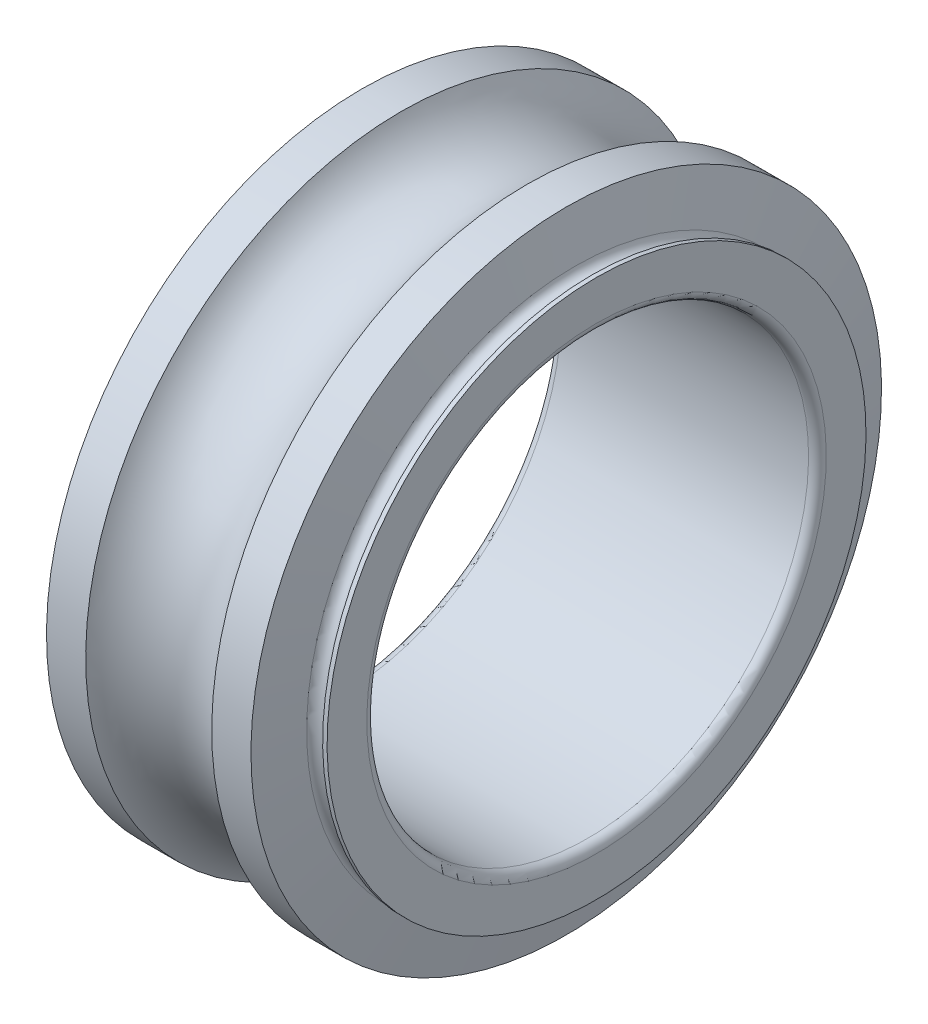
ISO-10303-21;
HEADER;
FILE_DESCRIPTION(('STEP AP214'),'2;1');
FILE_NAME('part.step','',(''),(''),'','','');
FILE_SCHEMA(('AUTOMOTIVE_DESIGN { 1 0 10303 214 1 1 1 1 }'));
ENDSEC;
DATA;
#1=APPLICATION_CONTEXT('core data for automotive mechanical design processes');
#2=APPLICATION_PROTOCOL_DEFINITION('international standard','automotive_design',2000,#1);
#3=PRODUCT_CONTEXT('',#1,'mechanical');
#4=PRODUCT('Part','Part','',(#3));
#5=PRODUCT_RELATED_PRODUCT_CATEGORY('part','',(#4));
#6=PRODUCT_DEFINITION_FORMATION('','',#4);
#7=PRODUCT_DEFINITION_CONTEXT('part definition',#1,'design');
#8=PRODUCT_DEFINITION('design','',#6,#7);
#9=PRODUCT_DEFINITION_SHAPE('','',#8);
#10=(LENGTH_UNIT() NAMED_UNIT(*) SI_UNIT(.MILLI.,.METRE.));
#11=(NAMED_UNIT(*) PLANE_ANGLE_UNIT() SI_UNIT($,.RADIAN.));
#12=(NAMED_UNIT(*) SI_UNIT($,.STERADIAN.) SOLID_ANGLE_UNIT());
#13=UNCERTAINTY_MEASURE_WITH_UNIT(LENGTH_MEASURE(1.E-05),#10,'distance_accuracy_value','');
#14=(GEOMETRIC_REPRESENTATION_CONTEXT(3) GLOBAL_UNCERTAINTY_ASSIGNED_CONTEXT((#13)) GLOBAL_UNIT_ASSIGNED_CONTEXT((#10,
#11,#12)) REPRESENTATION_CONTEXT('',''));
#15=CARTESIAN_POINT('',(0.,0.,0.));
#16=DIRECTION('',(0.,0.,1.));
#17=DIRECTION('',(1.,0.,0.));
#18=AXIS2_PLACEMENT_3D('',#15,#16,#17);
#19=CARTESIAN_POINT('',(7.30538188588983,0.,0.));
#20=DIRECTION('',(-1.,0.,0.));
#21=DIRECTION('',(0.,1.,0.));
#22=AXIS2_PLACEMENT_3D('',#19,#20,#21);
#23=CYLINDRICAL_SURFACE('',#22,10.7055);
#24=CARTESIAN_POINT('',(6.6396683738374,0.,0.));
#25=DIRECTION('',(1.,0.,0.));
#26=DIRECTION('',(0.,1.,0.));
#27=AXIS2_PLACEMENT_3D('',#24,#25,#26);
#28=CIRCLE('',#27,10.7055);
#29=CARTESIAN_POINT('',(6.6396683738374,10.7055,0.));
#30=VERTEX_POINT('',#29);
#31=EDGE_CURVE('E11',#30,#30,#28,.T.);
#32=ORIENTED_EDGE('',*,*,#31,.T.);
#33=EDGE_LOOP('',(#32));
#34=FACE_BOUND('',#33,.T.);
#35=CARTESIAN_POINT('',(7.97109539794226,0.,0.));
#36=DIRECTION('',(1.,0.,0.));
#37=DIRECTION('',(0.,1.,0.));
#38=AXIS2_PLACEMENT_3D('',#35,#36,#37);
#39=CIRCLE('',#38,10.7055);
#40=CARTESIAN_POINT('',(7.97109539794226,10.7055,0.));
#41=VERTEX_POINT('',#40);
#42=EDGE_CURVE('E96',#41,#41,#39,.T.);
#43=ORIENTED_EDGE('',*,*,#42,.F.);
#44=EDGE_LOOP('',(#43));
#45=FACE_BOUND('',#44,.T.);
#46=ADVANCED_FACE('F17',(#34,#45),#23,.T.);
#47=CARTESIAN_POINT('',(4.5,0.,0.));
#48=DIRECTION('',(1.,0.,0.));
#49=DIRECTION('',(0.,0.,-1.));
#50=AXIS2_PLACEMENT_3D('',#47,#48,#49);
#51=TOROIDAL_SURFACE('',#50,11.75,2.381);
#52=CARTESIAN_POINT('',(2.3603316261626,0.,0.));
#53=DIRECTION('',(1.,0.,0.));
#54=DIRECTION('',(0.,1.,0.));
#55=AXIS2_PLACEMENT_3D('',#52,#53,#54);
#56=CIRCLE('',#55,10.7055);
#57=CARTESIAN_POINT('',(2.3603316261626,10.7055,0.));
#58=VERTEX_POINT('',#57);
#59=EDGE_CURVE('E27',#58,#58,#56,.T.);
#60=ORIENTED_EDGE('',*,*,#59,.T.);
#61=EDGE_LOOP('',(#60));
#62=FACE_BOUND('',#61,.T.);
#63=ORIENTED_EDGE('',*,*,#31,.F.);
#64=EDGE_LOOP('',(#63));
#65=FACE_BOUND('',#64,.T.);
#66=ADVANCED_FACE('F106',(#62,#65),#51,.F.);
#67=CARTESIAN_POINT('',(1.69461811411017,0.,0.));
#68=DIRECTION('',(-1.,0.,0.));
#69=DIRECTION('',(0.,1.,0.));
#70=AXIS2_PLACEMENT_3D('',#67,#68,#69);
#71=CYLINDRICAL_SURFACE('',#70,10.7055);
#72=CARTESIAN_POINT('',(1.02890460205774,0.,0.));
#73=DIRECTION('',(1.,0.,0.));
#74=DIRECTION('',(0.,1.,0.));
#75=AXIS2_PLACEMENT_3D('',#72,#73,#74);
#76=CIRCLE('',#75,10.7055);
#77=CARTESIAN_POINT('',(1.02890460205774,10.7055,0.));
#78=VERTEX_POINT('',#77);
#79=EDGE_CURVE('E75',#78,#78,#76,.T.);
#80=ORIENTED_EDGE('',*,*,#79,.T.);
#81=EDGE_LOOP('',(#80));
#82=FACE_BOUND('',#81,.T.);
#83=ORIENTED_EDGE('',*,*,#59,.F.);
#84=EDGE_LOOP('',(#83));
#85=FACE_BOUND('',#84,.T.);
#86=ADVANCED_FACE('F19',(#82,#85),#71,.T.);
#87=CARTESIAN_POINT('',(0.887173463980702,0.,0.));
#88=DIRECTION('',(1.,0.,0.));
#89=DIRECTION('',(0.,1.,0.));
#90=AXIS2_PLACEMENT_3D('',#87,#88,#89);
#91=CONICAL_SURFACE('',#90,9.90170277334996,1.39626340159546);
#92=CARTESIAN_POINT('',(0.745442325903662,0.,0.));
#93=DIRECTION('',(1.,0.,0.));
#94=DIRECTION('',(0.,1.,0.));
#95=AXIS2_PLACEMENT_3D('',#92,#93,#94);
#96=CIRCLE('',#95,9.09790554669992);
#97=CARTESIAN_POINT('',(0.745442325903662,9.09790554669992,0.));
#98=VERTEX_POINT('',#97);
#99=EDGE_CURVE('E78',#98,#98,#96,.T.);
#100=ORIENTED_EDGE('',*,*,#99,.T.);
#101=EDGE_LOOP('',(#100));
#102=FACE_BOUND('',#101,.T.);
#103=ORIENTED_EDGE('',*,*,#79,.F.);
#104=EDGE_LOOP('',(#103));
#105=FACE_BOUND('',#104,.T.);
#106=ADVANCED_FACE('F117',(#102,#105),#91,.T.);
#107=CARTESIAN_POINT('',(0.45,0.,0.));
#108=DIRECTION('',(1.,0.,0.));
#109=DIRECTION('',(0.,0.,-1.));
#110=AXIS2_PLACEMENT_3D('',#107,#108,#109);
#111=TOROIDAL_SURFACE('',#110,9.15,0.3);
#112=CARTESIAN_POINT('',(0.15,0.,0.));
#113=DIRECTION('',(1.,0.,0.));
#114=DIRECTION('',(0.,1.,0.));
#115=AXIS2_PLACEMENT_3D('',#112,#113,#114);
#116=CIRCLE('',#115,9.15);
#117=CARTESIAN_POINT('',(0.15,9.15,0.));
#118=VERTEX_POINT('',#117);
#119=EDGE_CURVE('E81',#118,#118,#116,.T.);
#120=ORIENTED_EDGE('',*,*,#119,.T.);
#121=EDGE_LOOP('',(#120));
#122=FACE_BOUND('',#121,.T.);
#123=ORIENTED_EDGE('',*,*,#99,.F.);
#124=EDGE_LOOP('',(#123));
#125=FACE_BOUND('',#124,.T.);
#126=ADVANCED_FACE('F119',(#122,#125),#111,.F.);
#127=CARTESIAN_POINT('',(0.075,0.,0.));
#128=DIRECTION('',(-1.,0.,0.));
#129=DIRECTION('',(0.,1.,0.));
#130=AXIS2_PLACEMENT_3D('',#127,#128,#129);
#131=CYLINDRICAL_SURFACE('',#130,9.15);
#132=CARTESIAN_POINT('',(0.,0.,0.));
#133=DIRECTION('',(1.,0.,0.));
#134=DIRECTION('',(0.,1.,0.));
#135=AXIS2_PLACEMENT_3D('',#132,#133,#134);
#136=CIRCLE('',#135,9.15);
#137=CARTESIAN_POINT('',(0.,9.15,0.));
#138=VERTEX_POINT('',#137);
#139=EDGE_CURVE('E87',#138,#138,#136,.T.);
#140=ORIENTED_EDGE('',*,*,#139,.T.);
#141=EDGE_LOOP('',(#140));
#142=FACE_BOUND('',#141,.T.);
#143=ORIENTED_EDGE('',*,*,#119,.F.);
#144=EDGE_LOOP('',(#143));
#145=FACE_BOUND('',#144,.T.);
#146=ADVANCED_FACE('F125',(#142,#145),#131,.T.);
#147=CARTESIAN_POINT('',(0.,8.475,0.));
#148=DIRECTION('',(-1.,0.,0.));
#149=DIRECTION('',(0.,-1.,0.));
#150=AXIS2_PLACEMENT_3D('',#147,#148,#149);
#151=PLANE('',#150);
#152=CARTESIAN_POINT('',(0.,0.,0.));
#153=DIRECTION('',(1.,0.,0.));
#154=DIRECTION('',(0.,1.,0.));
#155=AXIS2_PLACEMENT_3D('',#152,#153,#154);
#156=CIRCLE('',#155,7.8);
#157=CARTESIAN_POINT('',(0.,7.8,0.));
#158=VERTEX_POINT('',#157);
#159=EDGE_CURVE('E52',#158,#158,#156,.T.);
#160=ORIENTED_EDGE('',*,*,#159,.T.);
#161=EDGE_LOOP('',(#160));
#162=FACE_BOUND('',#161,.T.);
#163=ORIENTED_EDGE('',*,*,#139,.F.);
#164=EDGE_LOOP('',(#163));
#165=FACE_BOUND('',#164,.T.);
#166=ADVANCED_FACE('F168',(#162,#165),#151,.T.);
#167=CARTESIAN_POINT('',(0.3,0.,0.));
#168=DIRECTION('',(1.,0.,0.));
#169=DIRECTION('',(0.,0.,-1.));
#170=AXIS2_PLACEMENT_3D('',#167,#168,#169);
#171=TOROIDAL_SURFACE('',#170,7.8,0.3);
#172=CARTESIAN_POINT('',(0.3,0.,0.));
#173=DIRECTION('',(1.,0.,0.));
#174=DIRECTION('',(0.,1.,0.));
#175=AXIS2_PLACEMENT_3D('',#172,#173,#174);
#176=CIRCLE('',#175,7.5);
#177=CARTESIAN_POINT('',(0.3,7.5,0.));
#178=VERTEX_POINT('',#177);
#179=EDGE_CURVE('E58',#178,#178,#176,.T.);
#180=ORIENTED_EDGE('',*,*,#179,.T.);
#181=EDGE_LOOP('',(#180));
#182=FACE_BOUND('',#181,.T.);
#183=ORIENTED_EDGE('',*,*,#159,.F.);
#184=EDGE_LOOP('',(#183));
#185=FACE_BOUND('',#184,.T.);
#186=ADVANCED_FACE('F115',(#182,#185),#171,.T.);
#187=CARTESIAN_POINT('',(4.5,0.,0.));
#188=DIRECTION('',(-1.,0.,0.));
#189=DIRECTION('',(0.,1.,0.));
#190=AXIS2_PLACEMENT_3D('',#187,#188,#189);
#191=CYLINDRICAL_SURFACE('',#190,7.5);
#192=CARTESIAN_POINT('',(8.7,0.,0.));
#193=DIRECTION('',(1.,0.,0.));
#194=DIRECTION('',(0.,1.,0.));
#195=AXIS2_PLACEMENT_3D('',#192,#193,#194);
#196=CIRCLE('',#195,7.5);
#197=CARTESIAN_POINT('',(8.7,7.5,0.));
#198=VERTEX_POINT('',#197);
#199=EDGE_CURVE('E64',#198,#198,#196,.T.);
#200=ORIENTED_EDGE('',*,*,#199,.T.);
#201=EDGE_LOOP('',(#200));
#202=FACE_BOUND('',#201,.T.);
#203=ORIENTED_EDGE('',*,*,#179,.F.);
#204=EDGE_LOOP('',(#203));
#205=FACE_BOUND('',#204,.T.);
#206=ADVANCED_FACE('F183',(#202,#205),#191,.F.);
#207=CARTESIAN_POINT('',(8.7,0.,0.));
#208=DIRECTION('',(1.,0.,0.));
#209=DIRECTION('',(0.,0.,-1.));
#210=AXIS2_PLACEMENT_3D('',#207,#208,#209);
#211=TOROIDAL_SURFACE('',#210,7.8,0.3);
#212=CARTESIAN_POINT('',(9.,0.,0.));
#213=DIRECTION('',(1.,0.,0.));
#214=DIRECTION('',(0.,1.,0.));
#215=AXIS2_PLACEMENT_3D('',#212,#213,#214);
#216=CIRCLE('',#215,7.8);
#217=CARTESIAN_POINT('',(9.,7.8,0.));
#218=VERTEX_POINT('',#217);
#219=EDGE_CURVE('E85',#218,#218,#216,.T.);
#220=ORIENTED_EDGE('',*,*,#219,.T.);
#221=EDGE_LOOP('',(#220));
#222=FACE_BOUND('',#221,.T.);
#223=ORIENTED_EDGE('',*,*,#199,.F.);
#224=EDGE_LOOP('',(#223));
#225=FACE_BOUND('',#224,.T.);
#226=ADVANCED_FACE('F190',(#222,#225),#211,.T.);
#227=CARTESIAN_POINT('',(9.,8.475,0.));
#228=DIRECTION('',(1.,0.,0.));
#229=DIRECTION('',(0.,1.,0.));
#230=AXIS2_PLACEMENT_3D('',#227,#228,#229);
#231=PLANE('',#230);
#232=CARTESIAN_POINT('',(9.,0.,0.));
#233=DIRECTION('',(1.,0.,0.));
#234=DIRECTION('',(0.,1.,0.));
#235=AXIS2_PLACEMENT_3D('',#232,#233,#234);
#236=CIRCLE('',#235,9.15);
#237=CARTESIAN_POINT('',(9.,9.15,0.));
#238=VERTEX_POINT('',#237);
#239=EDGE_CURVE('E21',#238,#238,#236,.T.);
#240=ORIENTED_EDGE('',*,*,#239,.T.);
#241=EDGE_LOOP('',(#240));
#242=FACE_BOUND('',#241,.T.);
#243=ORIENTED_EDGE('',*,*,#219,.F.);
#244=EDGE_LOOP('',(#243));
#245=FACE_BOUND('',#244,.T.);
#246=ADVANCED_FACE('F198',(#242,#245),#231,.T.);
#247=CARTESIAN_POINT('',(8.925,0.,0.));
#248=DIRECTION('',(-1.,0.,0.));
#249=DIRECTION('',(0.,1.,0.));
#250=AXIS2_PLACEMENT_3D('',#247,#248,#249);
#251=CYLINDRICAL_SURFACE('',#250,9.15);
#252=CARTESIAN_POINT('',(8.85,0.,0.));
#253=DIRECTION('',(1.,0.,0.));
#254=DIRECTION('',(0.,1.,0.));
#255=AXIS2_PLACEMENT_3D('',#252,#253,#254);
#256=CIRCLE('',#255,9.15);
#257=CARTESIAN_POINT('',(8.85,9.15,0.));
#258=VERTEX_POINT('',#257);
#259=EDGE_CURVE('E97',#258,#258,#256,.T.);
#260=ORIENTED_EDGE('',*,*,#259,.T.);
#261=EDGE_LOOP('',(#260));
#262=FACE_BOUND('',#261,.T.);
#263=ORIENTED_EDGE('',*,*,#239,.F.);
#264=EDGE_LOOP('',(#263));
#265=FACE_BOUND('',#264,.T.);
#266=ADVANCED_FACE('F207',(#262,#265),#251,.T.);
#267=CARTESIAN_POINT('',(8.55,0.,0.));
#268=DIRECTION('',(1.,0.,0.));
#269=DIRECTION('',(0.,0.,-1.));
#270=AXIS2_PLACEMENT_3D('',#267,#268,#269);
#271=TOROIDAL_SURFACE('',#270,9.15,0.3);
#272=CARTESIAN_POINT('',(8.25455767409634,0.,0.));
#273=DIRECTION('',(1.,0.,0.));
#274=DIRECTION('',(0.,1.,0.));
#275=AXIS2_PLACEMENT_3D('',#272,#273,#274);
#276=CIRCLE('',#275,9.09790554669992);
#277=CARTESIAN_POINT('',(8.25455767409634,9.09790554669992,0.));
#278=VERTEX_POINT('',#277);
#279=EDGE_CURVE('E93',#278,#278,#276,.T.);
#280=ORIENTED_EDGE('',*,*,#279,.T.);
#281=EDGE_LOOP('',(#280));
#282=FACE_BOUND('',#281,.T.);
#283=ORIENTED_EDGE('',*,*,#259,.F.);
#284=EDGE_LOOP('',(#283));
#285=FACE_BOUND('',#284,.T.);
#286=ADVANCED_FACE('F216',(#282,#285),#271,.F.);
#287=CARTESIAN_POINT('',(8.1128265360193,0.,0.));
#288=DIRECTION('',(-1.,0.,0.));
#289=DIRECTION('',(0.,1.,0.));
#290=AXIS2_PLACEMENT_3D('',#287,#288,#289);
#291=CONICAL_SURFACE('',#290,9.90170277334996,1.39626340159546);
#292=ORIENTED_EDGE('',*,*,#42,.T.);
#293=EDGE_LOOP('',(#292));
#294=FACE_BOUND('',#293,.T.);
#295=ORIENTED_EDGE('',*,*,#279,.F.);
#296=EDGE_LOOP('',(#295));
#297=FACE_BOUND('',#296,.T.);
#298=ADVANCED_FACE('F102',(#294,#297),#291,.T.);
#299=CLOSED_SHELL('',(#46,#66,#86,#106,#126,#146,#166,#186,#206,#226,#246,#266,#286,#298));
#300=MANIFOLD_SOLID_BREP('B1',#299);
#301=ADVANCED_BREP_SHAPE_REPRESENTATION('',(#18,#300),#14);
#302=SHAPE_DEFINITION_REPRESENTATION(#9,#301);
ENDSEC;
END-ISO-10303-21;
